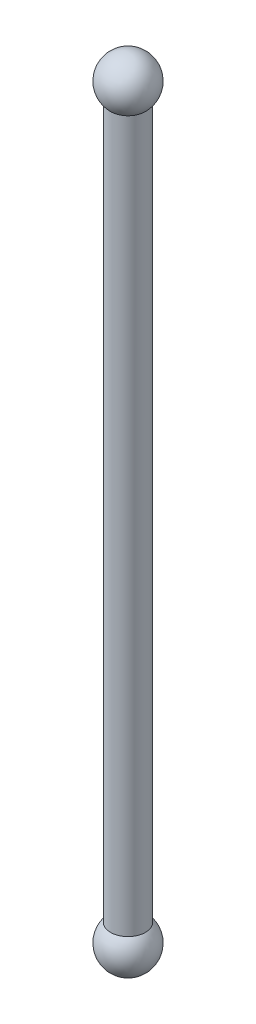
ISO-10303-21;
HEADER;
FILE_DESCRIPTION(('STEP AP214'),'2;1');
FILE_NAME('part.step','',(''),(''),'','','');
FILE_SCHEMA(('AUTOMOTIVE_DESIGN { 1 0 10303 214 1 1 1 1 }'));
ENDSEC;
DATA;
#1=APPLICATION_CONTEXT('core data for automotive mechanical design processes');
#2=APPLICATION_PROTOCOL_DEFINITION('international standard','automotive_design',2000,#1);
#3=PRODUCT_CONTEXT('',#1,'mechanical');
#4=PRODUCT('Part','Part','',(#3));
#5=PRODUCT_RELATED_PRODUCT_CATEGORY('part','',(#4));
#6=PRODUCT_DEFINITION_FORMATION('','',#4);
#7=PRODUCT_DEFINITION_CONTEXT('part definition',#1,'design');
#8=PRODUCT_DEFINITION('design','',#6,#7);
#9=PRODUCT_DEFINITION_SHAPE('','',#8);
#10=(LENGTH_UNIT() NAMED_UNIT(*) SI_UNIT(.MILLI.,.METRE.));
#11=(NAMED_UNIT(*) PLANE_ANGLE_UNIT() SI_UNIT($,.RADIAN.));
#12=(NAMED_UNIT(*) SI_UNIT($,.STERADIAN.) SOLID_ANGLE_UNIT());
#13=UNCERTAINTY_MEASURE_WITH_UNIT(LENGTH_MEASURE(1.E-05),#10,'distance_accuracy_value','');
#14=(GEOMETRIC_REPRESENTATION_CONTEXT(3) GLOBAL_UNCERTAINTY_ASSIGNED_CONTEXT((#13)) GLOBAL_UNIT_ASSIGNED_CONTEXT((#10,
#11,#12)) REPRESENTATION_CONTEXT('',''));
#15=CARTESIAN_POINT('',(0.,0.,0.));
#16=DIRECTION('',(0.,0.,1.));
#17=DIRECTION('',(1.,0.,0.));
#18=AXIS2_PLACEMENT_3D('',#15,#16,#17);
#19=CARTESIAN_POINT('',(0.,0.,0.));
#20=DIRECTION('',(0.,-1.,0.));
#21=DIRECTION('',(-1.,0.,0.));
#22=AXIS2_PLACEMENT_3D('',#19,#20,#21);
#23=SPHERICAL_SURFACE('',#22,10.);
#24=CARTESIAN_POINT('',(0.,7.14142842854285,0.));
#25=DIRECTION('',(0.,-1.,0.));
#26=DIRECTION('',(0.,0.,-1.));
#27=AXIS2_PLACEMENT_3D('',#24,#25,#26);
#28=CIRCLE('',#27,7.);
#29=CARTESIAN_POINT('',(0.,7.14142842854285,-7.));
#30=VERTEX_POINT('',#29);
#31=EDGE_CURVE('E10',#30,#30,#28,.T.);
#32=ORIENTED_EDGE('',*,*,#31,.T.);
#33=EDGE_LOOP('',(#32));
#34=FACE_BOUND('',#33,.T.);
#35=ADVANCED_FACE('F33',(#34),#23,.T.);
#36=CARTESIAN_POINT('',(0.,0.,0.));
#37=DIRECTION('',(0.,-1.,0.));
#38=DIRECTION('',(0.,0.,-1.));
#39=AXIS2_PLACEMENT_3D('',#36,#37,#38);
#40=CYLINDRICAL_SURFACE('',#39,7.);
#41=CARTESIAN_POINT('',(0.,292.858571571457,0.));
#42=DIRECTION('',(0.,-1.,0.));
#43=DIRECTION('',(0.,0.,-1.));
#44=AXIS2_PLACEMENT_3D('',#41,#42,#43);
#45=CIRCLE('',#44,7.);
#46=CARTESIAN_POINT('',(0.,292.858571571457,-7.));
#47=VERTEX_POINT('',#46);
#48=EDGE_CURVE('E39',#47,#47,#45,.T.);
#49=ORIENTED_EDGE('',*,*,#48,.T.);
#50=EDGE_LOOP('',(#49));
#51=FACE_BOUND('',#50,.T.);
#52=ORIENTED_EDGE('',*,*,#31,.F.);
#53=EDGE_LOOP('',(#52));
#54=FACE_BOUND('',#53,.T.);
#55=ADVANCED_FACE('F45',(#51,#54),#40,.T.);
#56=CARTESIAN_POINT('',(0.,300.,0.));
#57=DIRECTION('',(0.,-1.,0.));
#58=DIRECTION('',(1.,0.,0.));
#59=AXIS2_PLACEMENT_3D('',#56,#57,#58);
#60=SPHERICAL_SURFACE('',#59,10.);
#61=ORIENTED_EDGE('',*,*,#48,.F.);
#62=EDGE_LOOP('',(#61));
#63=FACE_BOUND('',#62,.T.);
#64=ADVANCED_FACE('F48',(#63),#60,.T.);
#65=CLOSED_SHELL('',(#35,#55,#64));
#66=MANIFOLD_SOLID_BREP('B2',#65);
#67=ADVANCED_BREP_SHAPE_REPRESENTATION('',(#18,#66),#14);
#68=SHAPE_DEFINITION_REPRESENTATION(#9,#67);
ENDSEC;
END-ISO-10303-21;
